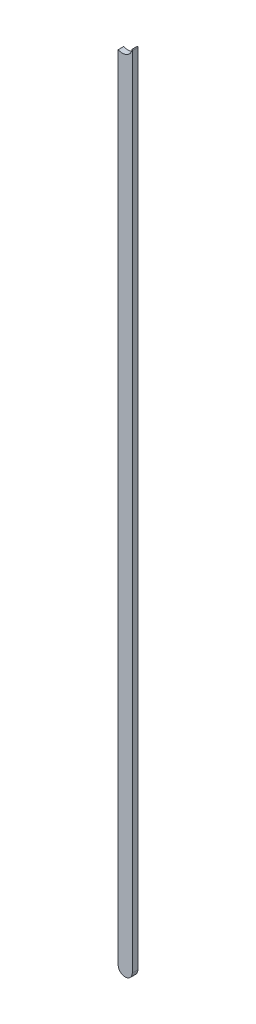
ISO-10303-21;
HEADER;
FILE_DESCRIPTION(('STEP AP214'),'2;1');
FILE_NAME('part.step','',(''),(''),'','','');
FILE_SCHEMA(('AUTOMOTIVE_DESIGN { 1 0 10303 214 1 1 1 1 }'));
ENDSEC;
DATA;
#1=APPLICATION_CONTEXT('core data for automotive mechanical design processes');
#2=APPLICATION_PROTOCOL_DEFINITION('international standard','automotive_design',2000,#1);
#3=PRODUCT_CONTEXT('',#1,'mechanical');
#4=PRODUCT('Part','Part','',(#3));
#5=PRODUCT_RELATED_PRODUCT_CATEGORY('part','',(#4));
#6=PRODUCT_DEFINITION_FORMATION('','',#4);
#7=PRODUCT_DEFINITION_CONTEXT('part definition',#1,'design');
#8=PRODUCT_DEFINITION('design','',#6,#7);
#9=PRODUCT_DEFINITION_SHAPE('','',#8);
#10=(LENGTH_UNIT() NAMED_UNIT(*) SI_UNIT(.MILLI.,.METRE.));
#11=(NAMED_UNIT(*) PLANE_ANGLE_UNIT() SI_UNIT($,.RADIAN.));
#12=(NAMED_UNIT(*) SI_UNIT($,.STERADIAN.) SOLID_ANGLE_UNIT());
#13=UNCERTAINTY_MEASURE_WITH_UNIT(LENGTH_MEASURE(1.E-05),#10,'distance_accuracy_value','');
#14=(GEOMETRIC_REPRESENTATION_CONTEXT(3) GLOBAL_UNCERTAINTY_ASSIGNED_CONTEXT((#13)) GLOBAL_UNIT_ASSIGNED_CONTEXT((#10,
#11,#12)) REPRESENTATION_CONTEXT('',''));
#15=CARTESIAN_POINT('',(0.,0.,0.));
#16=DIRECTION('',(0.,0.,1.));
#17=DIRECTION('',(1.,0.,0.));
#18=AXIS2_PLACEMENT_3D('',#15,#16,#17);
#19=CARTESIAN_POINT('',(119.6086,69.0626,0.));
#20=DIRECTION('',(-1.,0.,0.));
#21=DIRECTION('',(0.,1.,0.));
#22=AXIS2_PLACEMENT_3D('',#19,#20,#21);
#23=PLANE('',#22);
#24=DIRECTION('',(0.,1.,0.));
#25=VECTOR('',#24,1.);
#26=CARTESIAN_POINT('',(119.6086,69.0626,0.1999996));
#27=LINE('',#26,#25);
#28=CARTESIAN_POINT('',(119.6086,69.0626,0.1999996));
#29=VERTEX_POINT('',#28);
#30=CARTESIAN_POINT('',(119.6086,97.8154,0.1999996));
#31=VERTEX_POINT('',#30);
#32=EDGE_CURVE('E11',#29,#31,#27,.T.);
#33=ORIENTED_EDGE('',*,*,#32,.F.);
#34=DIRECTION('',(0.,0.,1.));
#35=VECTOR('',#34,1.);
#36=CARTESIAN_POINT('',(119.6086,69.0626,0.));
#37=LINE('',#36,#35);
#38=CARTESIAN_POINT('',(119.6086,69.0626,0.));
#39=VERTEX_POINT('',#38);
#40=EDGE_CURVE('E24',#39,#29,#37,.T.);
#41=ORIENTED_EDGE('',*,*,#40,.F.);
#42=DIRECTION('',(0.,1.,0.));
#43=VECTOR('',#42,1.);
#44=CARTESIAN_POINT('',(119.6086,69.0626,0.));
#45=LINE('',#44,#43);
#46=CARTESIAN_POINT('',(119.6086,97.8154,0.));
#47=VERTEX_POINT('',#46);
#48=EDGE_CURVE('E82',#39,#47,#45,.T.);
#49=ORIENTED_EDGE('',*,*,#48,.T.);
#50=DIRECTION('',(0.,0.,1.));
#51=VECTOR('',#50,1.);
#52=CARTESIAN_POINT('',(119.6086,97.8154,0.));
#53=LINE('',#52,#51);
#54=EDGE_CURVE('E37',#47,#31,#53,.T.);
#55=ORIENTED_EDGE('',*,*,#54,.T.);
#56=EDGE_LOOP('',(#33,#41,#49,#55));
#57=FACE_BOUND('',#56,.T.);
#58=ADVANCED_FACE('F17',(#57),#23,.F.);
#59=CARTESIAN_POINT('',(119.3546,97.8154,0.));
#60=DIRECTION('',(0.,0.,-1.));
#61=DIRECTION('',(1.,0.,0.));
#62=AXIS2_PLACEMENT_3D('',#59,#60,#61);
#63=CYLINDRICAL_SURFACE('',#62,0.254);
#64=CARTESIAN_POINT('',(119.3546,97.8154,0.1999996));
#65=DIRECTION('',(0.,0.,1.));
#66=DIRECTION('',(1.,0.,0.));
#67=AXIS2_PLACEMENT_3D('',#64,#65,#66);
#68=CIRCLE('',#67,0.254);
#69=CARTESIAN_POINT('',(119.604306178129,97.8619061781291,0.1999996));
#70=VERTEX_POINT('',#69);
#71=EDGE_CURVE('E98',#31,#70,#68,.T.);
#72=ORIENTED_EDGE('',*,*,#71,.F.);
#73=ORIENTED_EDGE('',*,*,#54,.F.);
#74=CARTESIAN_POINT('',(119.3546,97.8154,0.));
#75=DIRECTION('',(0.,0.,1.));
#76=DIRECTION('',(1.,0.,0.));
#77=AXIS2_PLACEMENT_3D('',#74,#75,#76);
#78=CIRCLE('',#77,0.254);
#79=CARTESIAN_POINT('',(119.604306178129,97.8619061781291,0.));
#80=VERTEX_POINT('',#79);
#81=EDGE_CURVE('E95',#47,#80,#78,.T.);
#82=ORIENTED_EDGE('',*,*,#81,.T.);
#83=DIRECTION('',(0.,0.,1.));
#84=VECTOR('',#83,1.);
#85=CARTESIAN_POINT('',(119.604306178129,97.8619061781291,0.));
#86=LINE('',#85,#84);
#87=EDGE_CURVE('E93',#80,#70,#86,.T.);
#88=ORIENTED_EDGE('',*,*,#87,.T.);
#89=EDGE_LOOP('',(#72,#73,#82,#88));
#90=FACE_BOUND('',#89,.T.);
#91=ADVANCED_FACE('F104',(#90),#63,.T.);
#92=CARTESIAN_POINT('',(119.253,97.917,0.));
#93=DIRECTION('',(0.,0.,-1.));
#94=DIRECTION('',(1.,0.,0.));
#95=AXIS2_PLACEMENT_3D('',#92,#93,#94);
#96=CYLINDRICAL_SURFACE('',#95,0.3556);
#97=DIRECTION('',(0.,0.,1.));
#98=VECTOR('',#97,1.);
#99=CARTESIAN_POINT('',(119.1006,97.5957125897269,0.));
#100=LINE('',#99,#98);
#101=CARTESIAN_POINT('',(119.1006,97.5957125897269,0.));
#102=VERTEX_POINT('',#101);
#103=CARTESIAN_POINT('',(119.1006,97.5957125897269,0.1999996));
#104=VERTEX_POINT('',#103);
#105=EDGE_CURVE('E73',#102,#104,#100,.T.);
#106=ORIENTED_EDGE('',*,*,#105,.T.);
#107=CARTESIAN_POINT('',(119.253,97.917,0.1999996));
#108=DIRECTION('',(0.,0.,1.));
#109=DIRECTION('',(1.,0.,0.));
#110=AXIS2_PLACEMENT_3D('',#107,#108,#109);
#111=CIRCLE('',#110,0.3556);
#112=EDGE_CURVE('E89',#104,#70,#111,.T.);
#113=ORIENTED_EDGE('',*,*,#112,.T.);
#114=ORIENTED_EDGE('',*,*,#87,.F.);
#115=CARTESIAN_POINT('',(119.253,97.917,0.));
#116=DIRECTION('',(0.,0.,1.));
#117=DIRECTION('',(1.,0.,0.));
#118=AXIS2_PLACEMENT_3D('',#115,#116,#117);
#119=CIRCLE('',#118,0.3556);
#120=EDGE_CURVE('E87',#102,#80,#119,.T.);
#121=ORIENTED_EDGE('',*,*,#120,.F.);
#122=EDGE_LOOP('',(#106,#113,#114,#121));
#123=FACE_BOUND('',#122,.T.);
#124=ADVANCED_FACE('F109',(#123),#96,.F.);
#125=CARTESIAN_POINT('',(119.1006,97.5957125897269,0.));
#126=DIRECTION('',(1.,0.,0.));
#127=DIRECTION('',(0.,-1.,0.));
#128=AXIS2_PLACEMENT_3D('',#125,#126,#127);
#129=PLANE('',#128);
#130=DIRECTION('',(0.,-1.,0.));
#131=VECTOR('',#130,1.);
#132=CARTESIAN_POINT('',(119.1006,97.8154,0.1999996));
#133=LINE('',#132,#131);
#134=CARTESIAN_POINT('',(119.1006,69.0626,0.1999996));
#135=VERTEX_POINT('',#134);
#136=EDGE_CURVE('E77',#104,#135,#133,.T.);
#137=ORIENTED_EDGE('',*,*,#136,.F.);
#138=ORIENTED_EDGE('',*,*,#105,.F.);
#139=DIRECTION('',(0.,-1.,0.));
#140=VECTOR('',#139,1.);
#141=CARTESIAN_POINT('',(119.1006,97.8154,0.));
#142=LINE('',#141,#140);
#143=CARTESIAN_POINT('',(119.1006,69.0626,0.));
#144=VERTEX_POINT('',#143);
#145=EDGE_CURVE('E69',#102,#144,#142,.T.);
#146=ORIENTED_EDGE('',*,*,#145,.T.);
#147=DIRECTION('',(0.,0.,1.));
#148=VECTOR('',#147,1.);
#149=CARTESIAN_POINT('',(119.1006,69.0626,0.));
#150=LINE('',#149,#148);
#151=EDGE_CURVE('E59',#144,#135,#150,.T.);
#152=ORIENTED_EDGE('',*,*,#151,.T.);
#153=EDGE_LOOP('',(#137,#138,#146,#152));
#154=FACE_BOUND('',#153,.T.);
#155=ADVANCED_FACE('F72',(#154),#129,.F.);
#156=CARTESIAN_POINT('',(119.3546,69.0626,0.));
#157=DIRECTION('',(0.,0.,-1.));
#158=DIRECTION('',(-1.,0.,0.));
#159=AXIS2_PLACEMENT_3D('',#156,#157,#158);
#160=CYLINDRICAL_SURFACE('',#159,0.253999999999995);
#161=CARTESIAN_POINT('',(119.3546,69.0626,0.1999996));
#162=DIRECTION('',(0.,0.,1.));
#163=DIRECTION('',(-1.,0.,0.));
#164=AXIS2_PLACEMENT_3D('',#161,#162,#163);
#165=CIRCLE('',#164,0.253999999999995);
#166=EDGE_CURVE('E65',#135,#29,#165,.T.);
#167=ORIENTED_EDGE('',*,*,#166,.F.);
#168=ORIENTED_EDGE('',*,*,#151,.F.);
#169=CARTESIAN_POINT('',(119.3546,69.0626,0.));
#170=DIRECTION('',(0.,0.,1.));
#171=DIRECTION('',(-1.,0.,0.));
#172=AXIS2_PLACEMENT_3D('',#169,#170,#171);
#173=CIRCLE('',#172,0.253999999999995);
#174=EDGE_CURVE('E63',#144,#39,#173,.T.);
#175=ORIENTED_EDGE('',*,*,#174,.T.);
#176=ORIENTED_EDGE('',*,*,#40,.T.);
#177=EDGE_LOOP('',(#167,#168,#175,#176));
#178=FACE_BOUND('',#177,.T.);
#179=ADVANCED_FACE('F61',(#178),#160,.T.);
#180=CARTESIAN_POINT('',(119.6086,69.0626,0.));
#181=DIRECTION('',(0.,0.,-1.));
#182=DIRECTION('',(-1.,0.,0.));
#183=AXIS2_PLACEMENT_3D('',#180,#181,#182);
#184=PLANE('',#183);
#185=ORIENTED_EDGE('',*,*,#48,.F.);
#186=ORIENTED_EDGE('',*,*,#174,.F.);
#187=ORIENTED_EDGE('',*,*,#145,.F.);
#188=ORIENTED_EDGE('',*,*,#120,.T.);
#189=ORIENTED_EDGE('',*,*,#81,.F.);
#190=EDGE_LOOP('',(#185,#186,#187,#188,#189));
#191=FACE_BOUND('',#190,.T.);
#192=ADVANCED_FACE('F80',(#191),#184,.T.);
#193=CARTESIAN_POINT('',(119.6086,69.0626,0.1999996));
#194=DIRECTION('',(0.,0.,-1.));
#195=DIRECTION('',(-1.,0.,0.));
#196=AXIS2_PLACEMENT_3D('',#193,#194,#195);
#197=PLANE('',#196);
#198=ORIENTED_EDGE('',*,*,#166,.T.);
#199=ORIENTED_EDGE('',*,*,#32,.T.);
#200=ORIENTED_EDGE('',*,*,#71,.T.);
#201=ORIENTED_EDGE('',*,*,#112,.F.);
#202=ORIENTED_EDGE('',*,*,#136,.T.);
#203=EDGE_LOOP('',(#198,#199,#200,#201,#202));
#204=FACE_BOUND('',#203,.T.);
#205=ADVANCED_FACE('F107',(#204),#197,.F.);
#206=CLOSED_SHELL('',(#58,#91,#124,#155,#179,#192,#205));
#207=MANIFOLD_SOLID_BREP('B1',#206);
#208=ADVANCED_BREP_SHAPE_REPRESENTATION('',(#18,#207),#14);
#209=SHAPE_DEFINITION_REPRESENTATION(#9,#208);
ENDSEC;
END-ISO-10303-21;
